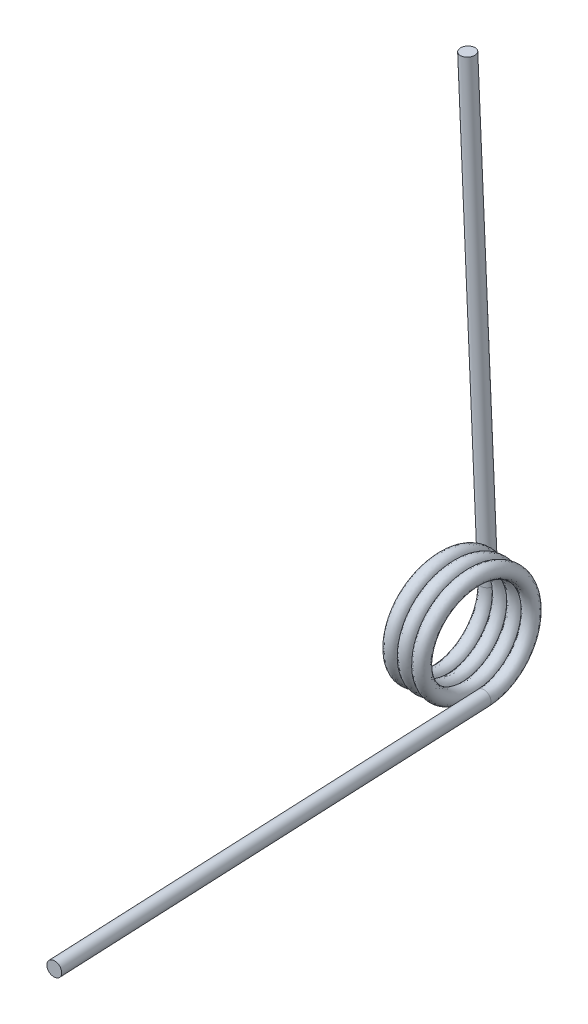
ISO-10303-21;
HEADER;
FILE_DESCRIPTION(('STEP AP214'),'2;1');
FILE_NAME('part.step','',(''),(''),'','','');
FILE_SCHEMA(('AUTOMOTIVE_DESIGN { 1 0 10303 214 1 1 1 1 }'));
ENDSEC;
DATA;
#1=APPLICATION_CONTEXT('core data for automotive mechanical design processes');
#2=APPLICATION_PROTOCOL_DEFINITION('international standard','automotive_design',2000,#1);
#3=PRODUCT_CONTEXT('',#1,'mechanical');
#4=PRODUCT('Part','Part','',(#3));
#5=PRODUCT_RELATED_PRODUCT_CATEGORY('part','',(#4));
#6=PRODUCT_DEFINITION_FORMATION('','',#4);
#7=PRODUCT_DEFINITION_CONTEXT('part definition',#1,'design');
#8=PRODUCT_DEFINITION('design','',#6,#7);
#9=PRODUCT_DEFINITION_SHAPE('','',#8);
#10=(LENGTH_UNIT() NAMED_UNIT(*) SI_UNIT(.MILLI.,.METRE.));
#11=(NAMED_UNIT(*) PLANE_ANGLE_UNIT() SI_UNIT($,.RADIAN.));
#12=(NAMED_UNIT(*) SI_UNIT($,.STERADIAN.) SOLID_ANGLE_UNIT());
#13=UNCERTAINTY_MEASURE_WITH_UNIT(LENGTH_MEASURE(1.E-05),#10,'distance_accuracy_value','');
#14=(GEOMETRIC_REPRESENTATION_CONTEXT(3) GLOBAL_UNCERTAINTY_ASSIGNED_CONTEXT((#13)) GLOBAL_UNIT_ASSIGNED_CONTEXT((#10,
#11,#12)) REPRESENTATION_CONTEXT('',''));
#15=CARTESIAN_POINT('',(0.,0.,0.));
#16=DIRECTION('',(0.,0.,1.));
#17=DIRECTION('',(1.,0.,0.));
#18=AXIS2_PLACEMENT_3D('',#15,#16,#17);
#19=CARTESIAN_POINT('',(-1.20528719606413,-8.6487,0.054083500292132));
#20=CARTESIAN_POINT('',(-1.40848719606413,-8.67992512345238,-4.93924577284818));
#21=CARTESIAN_POINT('',(-1.61168719606413,-4.37118768517857,-7.46295215956441));
#22=CARTESIAN_POINT('',(-1.81488719606413,-0.0624502469047598,-9.98665854628063));
#23=CARTESIAN_POINT('',(-2.01808719606413,4.27751231482143,-7.51703565985654));
#24=CARTESIAN_POINT('',(-2.22128719606413,8.61747487654762,-5.04741277343245));
#25=CARTESIAN_POINT('',(-2.42448719606413,8.6487,-0.054083500292133));
#26=CARTESIAN_POINT('',(-2.62768719606413,8.67992512345238,4.93924577284818));
#27=CARTESIAN_POINT('',(-2.83088719606413,4.37118768517857,7.46295215956441));
#28=CARTESIAN_POINT('',(-3.03408719606413,0.062450246904761,9.98665854628063));
#29=CARTESIAN_POINT('',(-3.23728719606413,-4.27751231482142,7.51703565985654));
#30=CARTESIAN_POINT('',(-3.44048719606413,-8.61747487654762,5.04741277343245));
#31=CARTESIAN_POINT('',(-3.64368719606413,-8.6487,0.054083500292132));
#32=CARTESIAN_POINT('',(-3.84688719606413,-8.67992512345238,-4.93924577284818));
#33=CARTESIAN_POINT('',(-4.05008719606413,-4.37118768517857,-7.46295215956441));
#34=CARTESIAN_POINT('',(-4.25328719606413,-0.0624502469047598,-9.98665854628063));
#35=CARTESIAN_POINT('',(-4.45648719606413,4.27751231482143,-7.51703565985654));
#36=CARTESIAN_POINT('',(-4.65968719606413,8.61747487654762,-5.04741277343245));
#37=CARTESIAN_POINT('',(-4.86288719606412,8.6487,-0.054083500292133));
#38=CARTESIAN_POINT('',(-5.06608719606412,8.67992512345238,4.93924577284818));
#39=CARTESIAN_POINT('',(-5.26928719606412,4.37118768517857,7.46295215956441));
#40=CARTESIAN_POINT('',(-5.47248719606412,0.062450246904761,9.98665854628063));
#41=CARTESIAN_POINT('',(-5.67568719606412,-4.27751231482142,7.51703565985654));
#42=CARTESIAN_POINT('',(-5.87888719606412,-8.61747487654762,5.04741277343245));
#43=CARTESIAN_POINT('',(-6.08208719606412,-8.6487,0.054083500292132));
#44=CARTESIAN_POINT('',(-6.28528719606412,-8.67992512345238,-4.93924577284818));
#45=CARTESIAN_POINT('',(-6.48848719606412,-4.37118768517857,-7.46295215956441));
#46=CARTESIAN_POINT('',(-6.69168719606412,-0.0624502469047598,-9.98665854628063));
#47=CARTESIAN_POINT('',(-6.89488719606412,4.27751231482143,-7.51703565985654));
#48=CARTESIAN_POINT('',(-7.09808719606412,8.61747487654762,-5.04741277343245));
#49=CARTESIAN_POINT('',(-7.30128719606412,8.6487,-0.054083500292133));
#50=CARTESIAN_POINT('',(-7.50448719606412,8.67992512345238,4.93924577284818));
#51=CARTESIAN_POINT('',(-7.70768719606412,4.37118768517857,7.46295215956441));
#52=CARTESIAN_POINT('',(-7.91088719606412,0.062450246904761,9.98665854628063));
#53=CARTESIAN_POINT('',(-8.11408719606412,-4.27751231482142,7.51703565985654));
#54=CARTESIAN_POINT('',(-8.31728719606412,-8.61747487654762,5.04741277343245));
#55=CARTESIAN_POINT('',(-8.52048719606412,-8.6487,0.054083500292132));
#56=CARTESIAN_POINT('',(-8.72368719606412,-8.67992512345238,-4.93924577284818));
#57=CARTESIAN_POINT('',(-8.92688719606411,-4.37118768517857,-7.46295215956441));
#58=CARTESIAN_POINT('',(-9.13008719606412,-0.0624502469047598,-9.98665854628063));
#59=CARTESIAN_POINT('',(-9.33328719606411,4.27751231482143,-7.51703565985654));
#60=CARTESIAN_POINT('',(-9.53648719606411,8.61747487654762,-5.04741277343245));
#61=CARTESIAN_POINT('',(-9.73968719606411,8.6487,-0.054083500292133));
#62=CARTESIAN_POINT('',(-9.94288719606411,8.67992512345238,4.93924577284818));
#63=CARTESIAN_POINT('',(-10.1460871960641,4.37118768517857,7.46295215956441));
#64=CARTESIAN_POINT('',(-10.3492871960641,0.062450246904761,9.98665854628063));
#65=CARTESIAN_POINT('',(-10.5524871960641,-4.27751231482142,7.51703565985654));
#66=CARTESIAN_POINT('',(-10.7556871960641,-8.61747487654762,5.04741277343245));
#67=CARTESIAN_POINT('',(-10.9588871960641,-8.6487,0.054083500292132));
#68=CARTESIAN_POINT('',(-1.20528719606413,-6.2357,0.0540835002921575));
#69=CARTESIAN_POINT('',(-1.40848719606413,-6.2669251234524,-3.54609957329359));
#70=CARTESIAN_POINT('',(-1.61168719606413,-3.16468768517859,-5.37323286023255));
#71=CARTESIAN_POINT('',(-1.81488719606413,-0.0624502469047891,-7.2003661471715));
#72=CARTESIAN_POINT('',(-2.01808719606413,3.07101231482141,-5.4273163605247));
#73=CARTESIAN_POINT('',(-2.22128719606413,6.20447487654761,-3.65426657387791));
#74=CARTESIAN_POINT('',(-2.42448719606413,6.2357,-0.0540835002921582));
#75=CARTESIAN_POINT('',(-2.62768719606413,6.2669251234524,3.54609957329359));
#76=CARTESIAN_POINT('',(-2.83088719606413,3.16468768517859,5.37323286023254));
#77=CARTESIAN_POINT('',(-3.03408719606413,0.06245024690479,7.2003661471715));
#78=CARTESIAN_POINT('',(-3.23728719606413,-3.07101231482141,5.42731636052471));
#79=CARTESIAN_POINT('',(-3.44048719606413,-6.20447487654761,3.65426657387791));
#80=CARTESIAN_POINT('',(-3.64368719606413,-6.2357,0.0540835002921575));
#81=CARTESIAN_POINT('',(-3.84688719606413,-6.2669251234524,-3.54609957329359));
#82=CARTESIAN_POINT('',(-4.05008719606413,-3.16468768517859,-5.37323286023255));
#83=CARTESIAN_POINT('',(-4.25328719606413,-0.0624502469047891,-7.2003661471715));
#84=CARTESIAN_POINT('',(-4.45648719606412,3.07101231482141,-5.4273163605247));
#85=CARTESIAN_POINT('',(-4.65968719606412,6.20447487654761,-3.65426657387791));
#86=CARTESIAN_POINT('',(-4.86288719606412,6.2357,-0.0540835002921582));
#87=CARTESIAN_POINT('',(-5.06608719606412,6.2669251234524,3.54609957329359));
#88=CARTESIAN_POINT('',(-5.26928719606412,3.16468768517859,5.37323286023254));
#89=CARTESIAN_POINT('',(-5.47248719606412,0.06245024690479,7.2003661471715));
#90=CARTESIAN_POINT('',(-5.67568719606412,-3.07101231482141,5.42731636052471));
#91=CARTESIAN_POINT('',(-5.87888719606412,-6.20447487654761,3.65426657387791));
#92=CARTESIAN_POINT('',(-6.08208719606412,-6.2357,0.0540835002921575));
#93=CARTESIAN_POINT('',(-6.28528719606412,-6.2669251234524,-3.54609957329359));
#94=CARTESIAN_POINT('',(-6.48848719606412,-3.16468768517859,-5.37323286023255));
#95=CARTESIAN_POINT('',(-6.69168719606412,-0.0624502469047891,-7.2003661471715));
#96=CARTESIAN_POINT('',(-6.89488719606412,3.07101231482141,-5.4273163605247));
#97=CARTESIAN_POINT('',(-7.09808719606412,6.20447487654761,-3.65426657387791));
#98=CARTESIAN_POINT('',(-7.30128719606412,6.2357,-0.0540835002921582));
#99=CARTESIAN_POINT('',(-7.50448719606412,6.2669251234524,3.54609957329359));
#100=CARTESIAN_POINT('',(-7.70768719606412,3.16468768517859,5.37323286023254));
#101=CARTESIAN_POINT('',(-7.91088719606412,0.06245024690479,7.2003661471715));
#102=CARTESIAN_POINT('',(-8.11408719606412,-3.07101231482141,5.42731636052471));
#103=CARTESIAN_POINT('',(-8.31728719606412,-6.20447487654761,3.65426657387791));
#104=CARTESIAN_POINT('',(-8.52048719606412,-6.2357,0.0540835002921575));
#105=CARTESIAN_POINT('',(-8.72368719606412,-6.2669251234524,-3.54609957329359));
#106=CARTESIAN_POINT('',(-8.92688719606411,-3.16468768517859,-5.37323286023255));
#107=CARTESIAN_POINT('',(-9.13008719606412,-0.0624502469047891,-7.2003661471715));
#108=CARTESIAN_POINT('',(-9.33328719606411,3.07101231482141,-5.4273163605247));
#109=CARTESIAN_POINT('',(-9.53648719606411,6.20447487654761,-3.65426657387791));
#110=CARTESIAN_POINT('',(-9.73968719606411,6.2357,-0.0540835002921582));
#111=CARTESIAN_POINT('',(-9.94288719606411,6.2669251234524,3.54609957329359));
#112=CARTESIAN_POINT('',(-10.1460871960641,3.16468768517859,5.37323286023254));
#113=CARTESIAN_POINT('',(-10.3492871960641,0.06245024690479,7.2003661471715));
#114=CARTESIAN_POINT('',(-10.5524871960641,-3.07101231482141,5.42731636052471));
#115=CARTESIAN_POINT('',(-10.7556871960641,-6.20447487654761,3.65426657387791));
#116=CARTESIAN_POINT('',(-10.9588871960641,-6.2357,0.0540835002921575));
#117=CARTESIAN_POINT('',(1.20528719606413,-6.2357,-0.0540835002922876));
#118=CARTESIAN_POINT('',(1.00208719606413,-6.20447487654753,-3.65426657387804));
#119=CARTESIAN_POINT('',(0.798887196064135,-3.0710123148213,-5.42731636052477));
#120=CARTESIAN_POINT('',(0.595687196064136,0.0624502469049385,-7.2003661471715));
#121=CARTESIAN_POINT('',(0.392487196064136,3.1646876851787,-5.37323286023248));
#122=CARTESIAN_POINT('',(0.189287196064137,6.26692512345247,-3.54609957329347));
#123=CARTESIAN_POINT('',(-0.0139128039358628,6.2357,0.0540835002922869));
#124=CARTESIAN_POINT('',(-0.217112803935862,6.20447487654753,3.65426657387804));
#125=CARTESIAN_POINT('',(-0.420312803935862,3.0710123148213,5.42731636052477));
#126=CARTESIAN_POINT('',(-0.623512803935861,-0.0624502469049376,7.2003661471715));
#127=CARTESIAN_POINT('',(-0.826712803935861,-3.1646876851787,5.37323286023248));
#128=CARTESIAN_POINT('',(-1.02991280393586,-6.26692512345247,3.54609957329347));
#129=CARTESIAN_POINT('',(-1.23311280393586,-6.2357,-0.0540835002922876));
#130=CARTESIAN_POINT('',(-1.43631280393586,-6.20447487654753,-3.65426657387804));
#131=CARTESIAN_POINT('',(-1.63951280393586,-3.0710123148213,-5.42731636052477));
#132=CARTESIAN_POINT('',(-1.84271280393586,0.0624502469049385,-7.2003661471715));
#133=CARTESIAN_POINT('',(-2.04591280393586,3.1646876851787,-5.37323286023248));
#134=CARTESIAN_POINT('',(-2.24911280393586,6.26692512345247,-3.54609957329347));
#135=CARTESIAN_POINT('',(-2.45231280393586,6.2357,0.0540835002922869));
#136=CARTESIAN_POINT('',(-2.65551280393586,6.20447487654753,3.65426657387804));
#137=CARTESIAN_POINT('',(-2.85871280393586,3.0710123148213,5.42731636052477));
#138=CARTESIAN_POINT('',(-3.06191280393586,-0.0624502469049376,7.2003661471715));
#139=CARTESIAN_POINT('',(-3.26511280393585,-3.1646876851787,5.37323286023248));
#140=CARTESIAN_POINT('',(-3.46831280393585,-6.26692512345247,3.54609957329347));
#141=CARTESIAN_POINT('',(-3.67151280393585,-6.2357,-0.0540835002922876));
#142=CARTESIAN_POINT('',(-3.87471280393585,-6.20447487654753,-3.65426657387804));
#143=CARTESIAN_POINT('',(-4.07791280393585,-3.0710123148213,-5.42731636052477));
#144=CARTESIAN_POINT('',(-4.28111280393585,0.0624502469049385,-7.2003661471715));
#145=CARTESIAN_POINT('',(-4.48431280393585,3.1646876851787,-5.37323286023248));
#146=CARTESIAN_POINT('',(-4.68751280393585,6.26692512345247,-3.54609957329347));
#147=CARTESIAN_POINT('',(-4.89071280393585,6.2357,0.0540835002922869));
#148=CARTESIAN_POINT('',(-5.09391280393585,6.20447487654753,3.65426657387804));
#149=CARTESIAN_POINT('',(-5.29711280393585,3.0710123148213,5.42731636052477));
#150=CARTESIAN_POINT('',(-5.50031280393585,-0.0624502469049376,7.2003661471715));
#151=CARTESIAN_POINT('',(-5.70351280393585,-3.1646876851787,5.37323286023248));
#152=CARTESIAN_POINT('',(-5.90671280393585,-6.26692512345247,3.54609957329347));
#153=CARTESIAN_POINT('',(-6.10991280393585,-6.2357,-0.0540835002922876));
#154=CARTESIAN_POINT('',(-6.31311280393585,-6.20447487654753,-3.65426657387804));
#155=CARTESIAN_POINT('',(-6.51631280393585,-3.0710123148213,-5.42731636052477));
#156=CARTESIAN_POINT('',(-6.71951280393585,0.0624502469049385,-7.2003661471715));
#157=CARTESIAN_POINT('',(-6.92271280393585,3.1646876851787,-5.37323286023248));
#158=CARTESIAN_POINT('',(-7.12591280393585,6.26692512345247,-3.54609957329347));
#159=CARTESIAN_POINT('',(-7.32911280393585,6.2357,0.0540835002922869));
#160=CARTESIAN_POINT('',(-7.53231280393584,6.20447487654753,3.65426657387804));
#161=CARTESIAN_POINT('',(-7.73551280393584,3.0710123148213,5.42731636052477));
#162=CARTESIAN_POINT('',(-7.93871280393584,-0.0624502469049376,7.2003661471715));
#163=CARTESIAN_POINT('',(-8.14191280393584,-3.1646876851787,5.37323286023248));
#164=CARTESIAN_POINT('',(-8.34511280393584,-6.26692512345247,3.54609957329347));
#165=CARTESIAN_POINT('',(-8.54831280393584,-6.2357,-0.0540835002922876));
#166=CARTESIAN_POINT('',(1.20528719606413,-8.6487,-0.0540835002923131));
#167=CARTESIAN_POINT('',(1.00208719606413,-8.61747487654752,-5.04741277343263));
#168=CARTESIAN_POINT('',(0.798887196064134,-4.27751231482127,-7.51703565985663));
#169=CARTESIAN_POINT('',(0.595687196064135,0.0624502469049678,-9.98665854628063));
#170=CARTESIAN_POINT('',(0.392487196064135,4.37118768517873,-7.46295215956432));
#171=CARTESIAN_POINT('',(0.189287196064136,8.67992512345248,-4.93924577284801));
#172=CARTESIAN_POINT('',(-0.0139128039358637,8.6487,0.0540835002923121));
#173=CARTESIAN_POINT('',(-0.217112803935863,8.61747487654752,5.04741277343263));
#174=CARTESIAN_POINT('',(-0.420312803935863,4.27751231482128,7.51703565985663));
#175=CARTESIAN_POINT('',(-0.623512803935862,-0.0624502469049666,9.98665854628063));
#176=CARTESIAN_POINT('',(-0.826712803935862,-4.37118768517872,7.46295215956432));
#177=CARTESIAN_POINT('',(-1.02991280393586,-8.67992512345248,4.93924577284801));
#178=CARTESIAN_POINT('',(-1.23311280393586,-8.6487,-0.0540835002923131));
#179=CARTESIAN_POINT('',(-1.43631280393586,-8.61747487654752,-5.04741277343263));
#180=CARTESIAN_POINT('',(-1.63951280393586,-4.27751231482127,-7.51703565985663));
#181=CARTESIAN_POINT('',(-1.84271280393586,0.0624502469049678,-9.98665854628063));
#182=CARTESIAN_POINT('',(-2.04591280393586,4.37118768517873,-7.46295215956432));
#183=CARTESIAN_POINT('',(-2.24911280393586,8.67992512345248,-4.93924577284801));
#184=CARTESIAN_POINT('',(-2.45231280393586,8.6487,0.0540835002923121));
#185=CARTESIAN_POINT('',(-2.65551280393586,8.61747487654752,5.04741277343263));
#186=CARTESIAN_POINT('',(-2.85871280393586,4.27751231482128,7.51703565985663));
#187=CARTESIAN_POINT('',(-3.06191280393586,-0.0624502469049666,9.98665854628063));
#188=CARTESIAN_POINT('',(-3.26511280393586,-4.37118768517872,7.46295215956432));
#189=CARTESIAN_POINT('',(-3.46831280393586,-8.67992512345248,4.93924577284801));
#190=CARTESIAN_POINT('',(-3.67151280393586,-8.6487,-0.0540835002923131));
#191=CARTESIAN_POINT('',(-3.87471280393585,-8.61747487654752,-5.04741277343263));
#192=CARTESIAN_POINT('',(-4.07791280393586,-4.27751231482127,-7.51703565985663));
#193=CARTESIAN_POINT('',(-4.28111280393585,0.0624502469049678,-9.98665854628063));
#194=CARTESIAN_POINT('',(-4.48431280393585,4.37118768517873,-7.46295215956432));
#195=CARTESIAN_POINT('',(-4.68751280393585,8.67992512345248,-4.93924577284801));
#196=CARTESIAN_POINT('',(-4.89071280393585,8.6487,0.0540835002923121));
#197=CARTESIAN_POINT('',(-5.09391280393585,8.61747487654752,5.04741277343263));
#198=CARTESIAN_POINT('',(-5.29711280393585,4.27751231482128,7.51703565985663));
#199=CARTESIAN_POINT('',(-5.50031280393585,-0.0624502469049666,9.98665854628063));
#200=CARTESIAN_POINT('',(-5.70351280393585,-4.37118768517872,7.46295215956432));
#201=CARTESIAN_POINT('',(-5.90671280393585,-8.67992512345248,4.93924577284801));
#202=CARTESIAN_POINT('',(-6.10991280393585,-8.6487,-0.0540835002923131));
#203=CARTESIAN_POINT('',(-6.31311280393585,-8.61747487654752,-5.04741277343263));
#204=CARTESIAN_POINT('',(-6.51631280393585,-4.27751231482127,-7.51703565985663));
#205=CARTESIAN_POINT('',(-6.71951280393585,0.0624502469049678,-9.98665854628063));
#206=CARTESIAN_POINT('',(-6.92271280393585,4.37118768517873,-7.46295215956432));
#207=CARTESIAN_POINT('',(-7.12591280393585,8.67992512345248,-4.93924577284801));
#208=CARTESIAN_POINT('',(-7.32911280393585,8.6487,0.0540835002923121));
#209=CARTESIAN_POINT('',(-7.53231280393585,8.61747487654752,5.04741277343263));
#210=CARTESIAN_POINT('',(-7.73551280393584,4.27751231482128,7.51703565985663));
#211=CARTESIAN_POINT('',(-7.93871280393585,-0.0624502469049666,9.98665854628063));
#212=CARTESIAN_POINT('',(-8.14191280393584,-4.37118768517872,7.46295215956432));
#213=CARTESIAN_POINT('',(-8.34511280393584,-8.67992512345248,4.93924577284801));
#214=CARTESIAN_POINT('',(-8.54831280393584,-8.6487,-0.0540835002923131));
#215=CARTESIAN_POINT('',(1.20528719606413,-11.0617,-0.0540835002923387));
#216=CARTESIAN_POINT('',(1.00208719606413,-11.0304748765475,-6.44055897298722));
#217=CARTESIAN_POINT('',(0.798887196064133,-5.48401231482125,-9.60675495918849));
#218=CARTESIAN_POINT('',(0.595687196064134,0.0624502469049971,-12.7729509453898));
#219=CARTESIAN_POINT('',(0.392487196064135,5.57768768517875,-9.55267145889616));
#220=CARTESIAN_POINT('',(0.189287196064135,11.0929251234525,-6.33239197240255));
#221=CARTESIAN_POINT('',(-0.0139128039358645,11.0617,0.0540835002923373));
#222=CARTESIAN_POINT('',(-0.217112803935864,11.0304748765475,6.44055897298722));
#223=CARTESIAN_POINT('',(-0.420312803935864,5.48401231482126,9.60675495918849));
#224=CARTESIAN_POINT('',(-0.623512803935863,-0.0624502469049955,12.7729509453898));
#225=CARTESIAN_POINT('',(-0.826712803935863,-5.57768768517874,9.55267145889616));
#226=CARTESIAN_POINT('',(-1.02991280393586,-11.0929251234525,6.33239197240255));
#227=CARTESIAN_POINT('',(-1.23311280393586,-11.0617,-0.0540835002923387));
#228=CARTESIAN_POINT('',(-1.43631280393586,-11.0304748765475,-6.44055897298722));
#229=CARTESIAN_POINT('',(-1.63951280393586,-5.48401231482125,-9.60675495918849));
#230=CARTESIAN_POINT('',(-1.84271280393586,0.0624502469049971,-12.7729509453898));
#231=CARTESIAN_POINT('',(-2.04591280393586,5.57768768517875,-9.55267145889616));
#232=CARTESIAN_POINT('',(-2.24911280393586,11.0929251234525,-6.33239197240255));
#233=CARTESIAN_POINT('',(-2.45231280393586,11.0617,0.0540835002923373));
#234=CARTESIAN_POINT('',(-2.65551280393586,11.0304748765475,6.44055897298722));
#235=CARTESIAN_POINT('',(-2.85871280393586,5.48401231482126,9.60675495918849));
#236=CARTESIAN_POINT('',(-3.06191280393586,-0.0624502469049955,12.7729509453898));
#237=CARTESIAN_POINT('',(-3.26511280393586,-5.57768768517874,9.55267145889616));
#238=CARTESIAN_POINT('',(-3.46831280393586,-11.0929251234525,6.33239197240255));
#239=CARTESIAN_POINT('',(-3.67151280393586,-11.0617,-0.0540835002923387));
#240=CARTESIAN_POINT('',(-3.87471280393586,-11.0304748765475,-6.44055897298722));
#241=CARTESIAN_POINT('',(-4.07791280393586,-5.48401231482125,-9.60675495918849));
#242=CARTESIAN_POINT('',(-4.28111280393585,0.0624502469049971,-12.7729509453898));
#243=CARTESIAN_POINT('',(-4.48431280393585,5.57768768517875,-9.55267145889616));
#244=CARTESIAN_POINT('',(-4.68751280393585,11.0929251234525,-6.33239197240255));
#245=CARTESIAN_POINT('',(-4.89071280393585,11.0617,0.0540835002923373));
#246=CARTESIAN_POINT('',(-5.09391280393585,11.0304748765475,6.44055897298722));
#247=CARTESIAN_POINT('',(-5.29711280393585,5.48401231482126,9.60675495918849));
#248=CARTESIAN_POINT('',(-5.50031280393585,-0.0624502469049955,12.7729509453898));
#249=CARTESIAN_POINT('',(-5.70351280393585,-5.57768768517874,9.55267145889616));
#250=CARTESIAN_POINT('',(-5.90671280393585,-11.0929251234525,6.33239197240255));
#251=CARTESIAN_POINT('',(-6.10991280393585,-11.0617,-0.0540835002923387));
#252=CARTESIAN_POINT('',(-6.31311280393585,-11.0304748765475,-6.44055897298722));
#253=CARTESIAN_POINT('',(-6.51631280393585,-5.48401231482125,-9.60675495918849));
#254=CARTESIAN_POINT('',(-6.71951280393585,0.0624502469049971,-12.7729509453898));
#255=CARTESIAN_POINT('',(-6.92271280393585,5.57768768517875,-9.55267145889616));
#256=CARTESIAN_POINT('',(-7.12591280393585,11.0929251234525,-6.33239197240255));
#257=CARTESIAN_POINT('',(-7.32911280393585,11.0617,0.0540835002923373));
#258=CARTESIAN_POINT('',(-7.53231280393585,11.0304748765475,6.44055897298722));
#259=CARTESIAN_POINT('',(-7.73551280393584,5.48401231482126,9.60675495918849));
#260=CARTESIAN_POINT('',(-7.93871280393585,-0.0624502469049955,12.7729509453898));
#261=CARTESIAN_POINT('',(-8.14191280393584,-5.57768768517874,9.55267145889616));
#262=CARTESIAN_POINT('',(-8.34511280393585,-11.0929251234525,6.33239197240255));
#263=CARTESIAN_POINT('',(-8.54831280393584,-11.0617,-0.0540835002923387));
#264=CARTESIAN_POINT('',(-1.20528719606413,-11.0617,0.0540835002921065));
#265=CARTESIAN_POINT('',(-1.40848719606413,-11.0929251234524,-6.33239197240278));
#266=CARTESIAN_POINT('',(-1.61168719606413,-5.57768768517855,-9.55267145889627));
#267=CARTESIAN_POINT('',(-1.81488719606413,-0.0624502469047305,-12.7729509453898));
#268=CARTESIAN_POINT('',(-2.01808719606413,5.48401231482145,-9.60675495918838));
#269=CARTESIAN_POINT('',(-2.22128719606413,11.0304748765476,-6.44055897298699));
#270=CARTESIAN_POINT('',(-2.42448719606413,11.0617,-0.0540835002921079));
#271=CARTESIAN_POINT('',(-2.62768719606413,11.0929251234524,6.33239197240277));
#272=CARTESIAN_POINT('',(-2.83088719606413,5.57768768517855,9.55267145889627));
#273=CARTESIAN_POINT('',(-3.03408719606413,0.0624502469047321,12.7729509453898));
#274=CARTESIAN_POINT('',(-3.23728719606413,-5.48401231482145,9.60675495918838));
#275=CARTESIAN_POINT('',(-3.44048719606413,-11.0304748765476,6.440558972987));
#276=CARTESIAN_POINT('',(-3.64368719606413,-11.0617,0.0540835002921065));
#277=CARTESIAN_POINT('',(-3.84688719606413,-11.0929251234524,-6.33239197240278));
#278=CARTESIAN_POINT('',(-4.05008719606413,-5.57768768517855,-9.55267145889627));
#279=CARTESIAN_POINT('',(-4.25328719606413,-0.0624502469047305,-12.7729509453898));
#280=CARTESIAN_POINT('',(-4.45648719606413,5.48401231482145,-9.60675495918838));
#281=CARTESIAN_POINT('',(-4.65968719606413,11.0304748765476,-6.44055897298699));
#282=CARTESIAN_POINT('',(-4.86288719606413,11.0617,-0.0540835002921079));
#283=CARTESIAN_POINT('',(-5.06608719606413,11.0929251234524,6.33239197240277));
#284=CARTESIAN_POINT('',(-5.26928719606413,5.57768768517855,9.55267145889627));
#285=CARTESIAN_POINT('',(-5.47248719606413,0.0624502469047321,12.7729509453898));
#286=CARTESIAN_POINT('',(-5.67568719606412,-5.48401231482145,9.60675495918838));
#287=CARTESIAN_POINT('',(-5.87888719606412,-11.0304748765476,6.440558972987));
#288=CARTESIAN_POINT('',(-6.08208719606412,-11.0617,0.0540835002921065));
#289=CARTESIAN_POINT('',(-6.28528719606412,-11.0929251234524,-6.33239197240278));
#290=CARTESIAN_POINT('',(-6.48848719606412,-5.57768768517855,-9.55267145889627));
#291=CARTESIAN_POINT('',(-6.69168719606412,-0.0624502469047305,-12.7729509453898));
#292=CARTESIAN_POINT('',(-6.89488719606412,5.48401231482145,-9.60675495918838));
#293=CARTESIAN_POINT('',(-7.09808719606412,11.0304748765476,-6.44055897298699));
#294=CARTESIAN_POINT('',(-7.30128719606412,11.0617,-0.0540835002921079));
#295=CARTESIAN_POINT('',(-7.50448719606412,11.0929251234524,6.33239197240277));
#296=CARTESIAN_POINT('',(-7.70768719606412,5.57768768517855,9.55267145889627));
#297=CARTESIAN_POINT('',(-7.91088719606412,0.0624502469047321,12.7729509453898));
#298=CARTESIAN_POINT('',(-8.11408719606412,-5.48401231482145,9.60675495918838));
#299=CARTESIAN_POINT('',(-8.31728719606412,-11.0304748765476,6.440558972987));
#300=CARTESIAN_POINT('',(-8.52048719606412,-11.0617,0.0540835002921065));
#301=CARTESIAN_POINT('',(-8.72368719606412,-11.0929251234524,-6.33239197240278));
#302=CARTESIAN_POINT('',(-8.92688719606412,-5.57768768517855,-9.55267145889627));
#303=CARTESIAN_POINT('',(-9.13008719606412,-0.0624502469047305,-12.7729509453898));
#304=CARTESIAN_POINT('',(-9.33328719606411,5.48401231482145,-9.60675495918838));
#305=CARTESIAN_POINT('',(-9.53648719606411,11.0304748765476,-6.44055897298699));
#306=CARTESIAN_POINT('',(-9.73968719606411,11.0617,-0.0540835002921079));
#307=CARTESIAN_POINT('',(-9.94288719606411,11.0929251234524,6.33239197240277));
#308=CARTESIAN_POINT('',(-10.1460871960641,5.57768768517855,9.55267145889627));
#309=CARTESIAN_POINT('',(-10.3492871960641,0.0624502469047321,12.7729509453898));
#310=CARTESIAN_POINT('',(-10.5524871960641,-5.48401231482145,9.60675495918838));
#311=CARTESIAN_POINT('',(-10.7556871960641,-11.0304748765476,6.440558972987));
#312=CARTESIAN_POINT('',(-10.9588871960641,-11.0617,0.0540835002921065));
#313=CARTESIAN_POINT('',(-1.20528719606413,-8.6487,0.054083500292132));
#314=CARTESIAN_POINT('',(-1.40848719606413,-8.67992512345238,-4.93924577284818));
#315=CARTESIAN_POINT('',(-1.61168719606413,-4.37118768517857,-7.46295215956441));
#316=CARTESIAN_POINT('',(-1.81488719606413,-0.0624502469047598,-9.98665854628063));
#317=CARTESIAN_POINT('',(-2.01808719606413,4.27751231482143,-7.51703565985654));
#318=CARTESIAN_POINT('',(-2.22128719606413,8.61747487654762,-5.04741277343245));
#319=CARTESIAN_POINT('',(-2.42448719606413,8.6487,-0.054083500292133));
#320=CARTESIAN_POINT('',(-2.62768719606413,8.67992512345238,4.93924577284818));
#321=CARTESIAN_POINT('',(-2.83088719606413,4.37118768517857,7.46295215956441));
#322=CARTESIAN_POINT('',(-3.03408719606413,0.062450246904761,9.98665854628063));
#323=CARTESIAN_POINT('',(-3.23728719606413,-4.27751231482142,7.51703565985654));
#324=CARTESIAN_POINT('',(-3.44048719606413,-8.61747487654762,5.04741277343245));
#325=CARTESIAN_POINT('',(-3.64368719606413,-8.6487,0.054083500292132));
#326=CARTESIAN_POINT('',(-3.84688719606413,-8.67992512345238,-4.93924577284818));
#327=CARTESIAN_POINT('',(-4.05008719606413,-4.37118768517857,-7.46295215956441));
#328=CARTESIAN_POINT('',(-4.25328719606413,-0.0624502469047598,-9.98665854628063));
#329=CARTESIAN_POINT('',(-4.45648719606413,4.27751231482143,-7.51703565985654));
#330=CARTESIAN_POINT('',(-4.65968719606413,8.61747487654762,-5.04741277343245));
#331=CARTESIAN_POINT('',(-4.86288719606412,8.6487,-0.054083500292133));
#332=CARTESIAN_POINT('',(-5.06608719606412,8.67992512345238,4.93924577284818));
#333=CARTESIAN_POINT('',(-5.26928719606412,4.37118768517857,7.46295215956441));
#334=CARTESIAN_POINT('',(-5.47248719606412,0.062450246904761,9.98665854628063));
#335=CARTESIAN_POINT('',(-5.67568719606412,-4.27751231482142,7.51703565985654));
#336=CARTESIAN_POINT('',(-5.87888719606412,-8.61747487654762,5.04741277343245));
#337=CARTESIAN_POINT('',(-6.08208719606412,-8.6487,0.054083500292132));
#338=CARTESIAN_POINT('',(-6.28528719606412,-8.67992512345238,-4.93924577284818));
#339=CARTESIAN_POINT('',(-6.48848719606412,-4.37118768517857,-7.46295215956441));
#340=CARTESIAN_POINT('',(-6.69168719606412,-0.0624502469047598,-9.98665854628063));
#341=CARTESIAN_POINT('',(-6.89488719606412,4.27751231482143,-7.51703565985654));
#342=CARTESIAN_POINT('',(-7.09808719606412,8.61747487654762,-5.04741277343245));
#343=CARTESIAN_POINT('',(-7.30128719606412,8.6487,-0.054083500292133));
#344=CARTESIAN_POINT('',(-7.50448719606412,8.67992512345238,4.93924577284818));
#345=CARTESIAN_POINT('',(-7.70768719606412,4.37118768517857,7.46295215956441));
#346=CARTESIAN_POINT('',(-7.91088719606412,0.062450246904761,9.98665854628063));
#347=CARTESIAN_POINT('',(-8.11408719606412,-4.27751231482142,7.51703565985654));
#348=CARTESIAN_POINT('',(-8.31728719606412,-8.61747487654762,5.04741277343245));
#349=CARTESIAN_POINT('',(-8.52048719606412,-8.6487,0.054083500292132));
#350=CARTESIAN_POINT('',(-8.72368719606412,-8.67992512345238,-4.93924577284818));
#351=CARTESIAN_POINT('',(-8.92688719606411,-4.37118768517857,-7.46295215956441));
#352=CARTESIAN_POINT('',(-9.13008719606412,-0.0624502469047598,-9.98665854628063));
#353=CARTESIAN_POINT('',(-9.33328719606411,4.27751231482143,-7.51703565985654));
#354=CARTESIAN_POINT('',(-9.53648719606411,8.61747487654762,-5.04741277343245));
#355=CARTESIAN_POINT('',(-9.73968719606411,8.6487,-0.054083500292133));
#356=CARTESIAN_POINT('',(-9.94288719606411,8.67992512345238,4.93924577284818));
#357=CARTESIAN_POINT('',(-10.1460871960641,4.37118768517857,7.46295215956441));
#358=CARTESIAN_POINT('',(-10.3492871960641,0.062450246904761,9.98665854628063));
#359=CARTESIAN_POINT('',(-10.5524871960641,-4.27751231482142,7.51703565985654));
#360=CARTESIAN_POINT('',(-10.7556871960641,-8.61747487654762,5.04741277343245));
#361=CARTESIAN_POINT('',(-10.9588871960641,-8.6487,0.054083500292132));
#362=(BOUNDED_SURFACE() B_SPLINE_SURFACE(3,2,((#19,#20,#21,#22,#23,#24,#25,#26,#27,#28,#29,#30,
#31,#32,#33,#34,#35,#36,#37,#38,#39,#40,#41,#42,#43,#44,#45,#46,#47,#48,#49,#50,#51,#52,#53,#54,
#55,#56,#57,#58,#59,#60,#61,#62,#63,#64,#65,#66,#67),(#68,#69,#70,#71,#72,#73,#74,#75,#76,#77,
#78,#79,#80,#81,#82,#83,#84,#85,#86,#87,#88,#89,#90,#91,#92,#93,#94,#95,#96,#97,#98,#99,#100,
#101,#102,#103,#104,#105,#106,#107,#108,#109,#110,#111,#112,#113,#114,#115,#116),(#117,#118,
#119,#120,#121,#122,#123,#124,#125,#126,#127,#128,#129,#130,#131,#132,#133,#134,#135,#136,#137,
#138,#139,#140,#141,#142,#143,#144,#145,#146,#147,#148,#149,#150,#151,#152,#153,#154,#155,#156,
#157,#158,#159,#160,#161,#162,#163,#164,#165),(#166,#167,#168,#169,#170,#171,#172,#173,#174,
#175,#176,#177,#178,#179,#180,#181,#182,#183,#184,#185,#186,#187,#188,#189,#190,#191,#192,#193,
#194,#195,#196,#197,#198,#199,#200,#201,#202,#203,#204,#205,#206,#207,#208,#209,#210,#211,#212,
#213,#214),(#215,#216,#217,#218,#219,#220,#221,#222,#223,#224,#225,#226,#227,#228,#229,#230,
#231,#232,#233,#234,#235,#236,#237,#238,#239,#240,#241,#242,#243,#244,#245,#246,#247,#248,#249,
#250,#251,#252,#253,#254,#255,#256,#257,#258,#259,#260,#261,#262,#263),(#264,#265,#266,#267,
#268,#269,#270,#271,#272,#273,#274,#275,#276,#277,#278,#279,#280,#281,#282,#283,#284,#285,#286,
#287,#288,#289,#290,#291,#292,#293,#294,#295,#296,#297,#298,#299,#300,#301,#302,#303,#304,#305,
#306,#307,#308,#309,#310,#311,#312),(#313,#314,#315,#316,#317,#318,#319,#320,#321,#322,#323,
#324,#325,#326,#327,#328,#329,#330,#331,#332,#333,#334,#335,#336,#337,#338,#339,#340,#341,#342,
#343,#344,#345,#346,#347,#348,#349,#350,#351,#352,#353,#354,#355,#356,#357,#358,#359,#360,
#361)),.UNSPECIFIED.,.T.,.F.,.F.) B_SPLINE_SURFACE_WITH_KNOTS((4,3,4),(3,2,2,2,2,2,2,2,2,2,2,2,
2,2,2,2,2,2,2,2,2,2,2,2,3),(0.,0.5,1.),(0.,0.0416666666666667,0.0833333333333333,0.125,
0.166666666666667,0.208333333333333,0.25,0.291666666666667,0.333333333333333,0.375,
0.416666666666667,0.458333333333333,0.5,0.541666666666667,0.583333333333333,0.625,
0.666666666666667,0.708333333333333,0.75,0.791666666666667,0.833333333333333,0.875,
0.916666666666667,0.958333333333333,1.),
.UNSPECIFIED.) GEOMETRIC_REPRESENTATION_ITEM() RATIONAL_B_SPLINE_SURFACE(((1.,0.866025403784439,
1.,0.866025403784439,1.,0.866025403784439,1.,0.866025403784439,1.,0.866025403784439,1.,
0.866025403784439,1.,0.866025403784439,1.,0.866025403784439,1.,0.866025403784439,1.,
0.866025403784439,1.,0.866025403784439,1.,0.866025403784439,1.,0.866025403784439,1.,
0.866025403784439,1.,0.866025403784439,1.,0.866025403784439,1.,0.866025403784439,1.,
0.866025403784439,1.,0.866025403784439,1.,0.866025403784439,1.,0.866025403784439,1.,
0.866025403784439,1.,0.866025403784439,1.,0.866025403784439,1.),(0.333333333333333,
0.288675134594813,0.333333333333333,0.288675134594813,0.333333333333333,0.288675134594813,
0.333333333333333,0.288675134594813,0.333333333333333,0.288675134594813,0.333333333333333,
0.288675134594813,0.333333333333333,0.288675134594813,0.333333333333333,0.288675134594813,
0.333333333333333,0.288675134594813,0.333333333333333,0.288675134594813,0.333333333333333,
0.288675134594813,0.333333333333333,0.288675134594813,0.333333333333333,0.288675134594813,
0.333333333333333,0.288675134594813,0.333333333333333,0.288675134594813,0.333333333333333,
0.288675134594813,0.333333333333333,0.288675134594813,0.333333333333333,0.288675134594813,
0.333333333333333,0.288675134594813,0.333333333333333,0.288675134594813,0.333333333333333,
0.288675134594813,0.333333333333333,0.288675134594813,0.333333333333333,0.288675134594813,
0.333333333333333,0.288675134594813,0.333333333333333),(0.333333333333333,0.288675134594813,
0.333333333333333,0.288675134594813,0.333333333333333,0.288675134594813,0.333333333333333,
0.288675134594813,0.333333333333333,0.288675134594813,0.333333333333333,0.288675134594813,
0.333333333333333,0.288675134594813,0.333333333333333,0.288675134594813,0.333333333333333,
0.288675134594813,0.333333333333333,0.288675134594813,0.333333333333333,0.288675134594813,
0.333333333333333,0.288675134594813,0.333333333333333,0.288675134594813,0.333333333333333,
0.288675134594813,0.333333333333333,0.288675134594813,0.333333333333333,0.288675134594813,
0.333333333333333,0.288675134594813,0.333333333333333,0.288675134594813,0.333333333333333,
0.288675134594813,0.333333333333333,0.288675134594813,0.333333333333333,0.288675134594813,
0.333333333333333,0.288675134594813,0.333333333333333,0.288675134594813,0.333333333333333,
0.288675134594813,0.333333333333333),(1.,0.866025403784439,1.,0.866025403784439,1.,
0.866025403784439,1.,0.866025403784439,1.,0.866025403784439,1.,0.866025403784439,1.,
0.866025403784439,1.,0.866025403784439,1.,0.866025403784439,1.,0.866025403784439,1.,
0.866025403784439,1.,0.866025403784439,1.,0.866025403784439,1.,0.866025403784439,1.,
0.866025403784439,1.,0.866025403784439,1.,0.866025403784439,1.,0.866025403784439,1.,
0.866025403784439,1.,0.866025403784439,1.,0.866025403784439,1.,0.866025403784439,1.,
0.866025403784439,1.,0.866025403784439,1.),(0.333333333333333,0.288675134594813,
0.333333333333333,0.288675134594813,0.333333333333333,0.288675134594813,0.333333333333333,
0.288675134594813,0.333333333333333,0.288675134594813,0.333333333333333,0.288675134594813,
0.333333333333333,0.288675134594813,0.333333333333333,0.288675134594813,0.333333333333333,
0.288675134594813,0.333333333333333,0.288675134594813,0.333333333333333,0.288675134594813,
0.333333333333333,0.288675134594813,0.333333333333333,0.288675134594813,0.333333333333333,
0.288675134594813,0.333333333333333,0.288675134594813,0.333333333333333,0.288675134594813,
0.333333333333333,0.288675134594813,0.333333333333333,0.288675134594813,0.333333333333333,
0.288675134594813,0.333333333333333,0.288675134594813,0.333333333333333,0.288675134594813,
0.333333333333333,0.288675134594813,0.333333333333333,0.288675134594813,0.333333333333333,
0.288675134594813,0.333333333333333),(0.333333333333333,0.288675134594813,0.333333333333333,
0.288675134594813,0.333333333333333,0.288675134594813,0.333333333333333,0.288675134594813,
0.333333333333333,0.288675134594813,0.333333333333333,0.288675134594813,0.333333333333333,
0.288675134594813,0.333333333333333,0.288675134594813,0.333333333333333,0.288675134594813,
0.333333333333333,0.288675134594813,0.333333333333333,0.288675134594813,0.333333333333333,
0.288675134594813,0.333333333333333,0.288675134594813,0.333333333333333,0.288675134594813,
0.333333333333333,0.288675134594813,0.333333333333333,0.288675134594813,0.333333333333333,
0.288675134594813,0.333333333333333,0.288675134594813,0.333333333333333,0.288675134594813,
0.333333333333333,0.288675134594813,0.333333333333333,0.288675134594813,0.333333333333333,
0.288675134594813,0.333333333333333,0.288675134594813,0.333333333333333,0.288675134594813,
0.333333333333333),(1.,0.866025403784439,1.,0.866025403784439,1.,0.866025403784439,1.,
0.866025403784439,1.,0.866025403784439,1.,0.866025403784439,1.,0.866025403784439,1.,
0.866025403784439,1.,0.866025403784439,1.,0.866025403784439,1.,0.866025403784439,1.,
0.866025403784439,1.,0.866025403784439,1.,0.866025403784439,1.,0.866025403784439,1.,
0.866025403784439,1.,0.866025403784439,1.,0.866025403784439,1.,0.866025403784439,1.,
0.866025403784439,1.,0.866025403784439,1.,0.866025403784439,1.,0.866025403784439,1.,
0.866025403784439,1.))) REPRESENTATION_ITEM('') SURFACE());
#363=CARTESIAN_POINT('',(-7.9248,4.67783322994317E-13,-8.6487));
#364=DIRECTION('',(-0.0448267718957502,0.998994775022075,0.));
#365=DIRECTION('',(-0.998994775022075,-0.0448267718957502,0.));
#366=AXIS2_PLACEMENT_3D('',#363,#364,#365);
#367=CIRCLE('',#366,1.2065);
#368=CARTESIAN_POINT('',(-9.13008719606413,-0.0540835002917548,-8.6487));
#369=VERTEX_POINT('',#368);
#370=EDGE_CURVE('E10',#369,#369,#367,.T.);
#371=CARTESIAN_POINT('',(0.,-8.6487,0.));
#372=DIRECTION('',(0.0448267718957502,0.,0.998994775022075));
#373=DIRECTION('',(0.998994775022075,0.,-0.0448267718957502));
#374=AXIS2_PLACEMENT_3D('',#371,#372,#373);
#375=CIRCLE('',#374,1.2065);
#376=CARTESIAN_POINT('',(1.20528719606413,-8.6487,-0.0540835002923142));
#377=VERTEX_POINT('',#376);
#378=EDGE_CURVE('E49',#377,#377,#375,.T.);
#379=ORIENTED_EDGE('',*,*,#370,.F.);
#380=EDGE_LOOP('',(#379));
#381=FACE_BOUND('',#380,.T.);
#382=ORIENTED_EDGE('',*,*,#378,.F.);
#383=EDGE_LOOP('',(#382));
#384=FACE_BOUND('',#383,.T.);
#385=ADVANCED_FACE('F37',(#381,#384),#362,.T.);
#386=CARTESIAN_POINT('',(3.41580001845616,-8.6487000000008,76.123401856682));
#387=DIRECTION('',(-0.0448267718957502,0.,-0.998994775022075));
#388=DIRECTION('',(-0.998994775022075,0.,0.0448267718957502));
#389=AXIS2_PLACEMENT_3D('',#386,#387,#388);
#390=CYLINDRICAL_SURFACE('',#389,1.2065);
#391=CARTESIAN_POINT('',(3.41580001845616,-8.6487000000008,76.123401856682));
#392=DIRECTION('',(0.0448267718957502,0.,0.998994775022075));
#393=DIRECTION('',(0.998994775022075,0.,-0.0448267718957502));
#394=AXIS2_PLACEMENT_3D('',#391,#392,#393);
#395=CIRCLE('',#394,1.2065);
#396=CARTESIAN_POINT('',(4.6210872145203,-8.6487000000008,76.0693183563898));
#397=VERTEX_POINT('',#396);
#398=EDGE_CURVE('E45',#397,#397,#395,.T.);
#399=ORIENTED_EDGE('',*,*,#398,.F.);
#400=EDGE_LOOP('',(#399));
#401=FACE_BOUND('',#400,.T.);
#402=ORIENTED_EDGE('',*,*,#378,.T.);
#403=EDGE_LOOP('',(#402));
#404=FACE_BOUND('',#403,.T.);
#405=ADVANCED_FACE('F70',(#401,#404),#390,.T.);
#406=CARTESIAN_POINT('',(3.41580001845616,-8.6487000000008,76.123401856682));
#407=DIRECTION('',(0.0448267718957502,0.,0.998994775022075));
#408=DIRECTION('',(0.998994775022075,0.,-0.0448267718957502));
#409=AXIS2_PLACEMENT_3D('',#406,#407,#408);
#410=PLANE('',#409);
#411=ORIENTED_EDGE('',*,*,#398,.T.);
#412=EDGE_LOOP('',(#411));
#413=FACE_BOUND('',#412,.T.);
#414=ADVANCED_FACE('F63',(#413),#410,.T.);
#415=CARTESIAN_POINT('',(-11.3406000184562,76.1234018566826,-8.64869999999587));
#416=DIRECTION('',(0.0448267718957502,-0.998994775022075,0.));
#417=DIRECTION('',(0.998994775022075,0.0448267718957502,0.));
#418=AXIS2_PLACEMENT_3D('',#415,#416,#417);
#419=CYLINDRICAL_SURFACE('',#418,1.2065);
#420=CARTESIAN_POINT('',(-11.3406000184562,76.1234018566826,-8.64869999999587));
#421=DIRECTION('',(-0.0448267718957502,0.998994775022075,0.));
#422=DIRECTION('',(-0.998994775022075,-0.0448267718957502,0.));
#423=AXIS2_PLACEMENT_3D('',#420,#421,#422);
#424=CIRCLE('',#423,1.2065);
#425=CARTESIAN_POINT('',(-12.5458872145203,76.0693183563904,-8.64869999999587));
#426=VERTEX_POINT('',#425);
#427=EDGE_CURVE('E54',#426,#426,#424,.T.);
#428=ORIENTED_EDGE('',*,*,#427,.F.);
#429=EDGE_LOOP('',(#428));
#430=FACE_BOUND('',#429,.T.);
#431=ORIENTED_EDGE('',*,*,#370,.T.);
#432=EDGE_LOOP('',(#431));
#433=FACE_BOUND('',#432,.T.);
#434=ADVANCED_FACE('F61',(#430,#433),#419,.T.);
#435=CARTESIAN_POINT('',(-11.3406000184562,76.1234018566826,-8.64869999999587));
#436=DIRECTION('',(-0.0448267718957502,0.998994775022075,0.));
#437=DIRECTION('',(-0.998994775022075,-0.0448267718957502,0.));
#438=AXIS2_PLACEMENT_3D('',#435,#436,#437);
#439=PLANE('',#438);
#440=ORIENTED_EDGE('',*,*,#427,.T.);
#441=EDGE_LOOP('',(#440));
#442=FACE_BOUND('',#441,.T.);
#443=ADVANCED_FACE('F59',(#442),#439,.T.);
#444=CLOSED_SHELL('',(#385,#405,#414,#434,#443));
#445=MANIFOLD_SOLID_BREP('B2',#444);
#446=ADVANCED_BREP_SHAPE_REPRESENTATION('',(#18,#445),#14);
#447=SHAPE_DEFINITION_REPRESENTATION(#9,#446);
ENDSEC;
END-ISO-10303-21;
